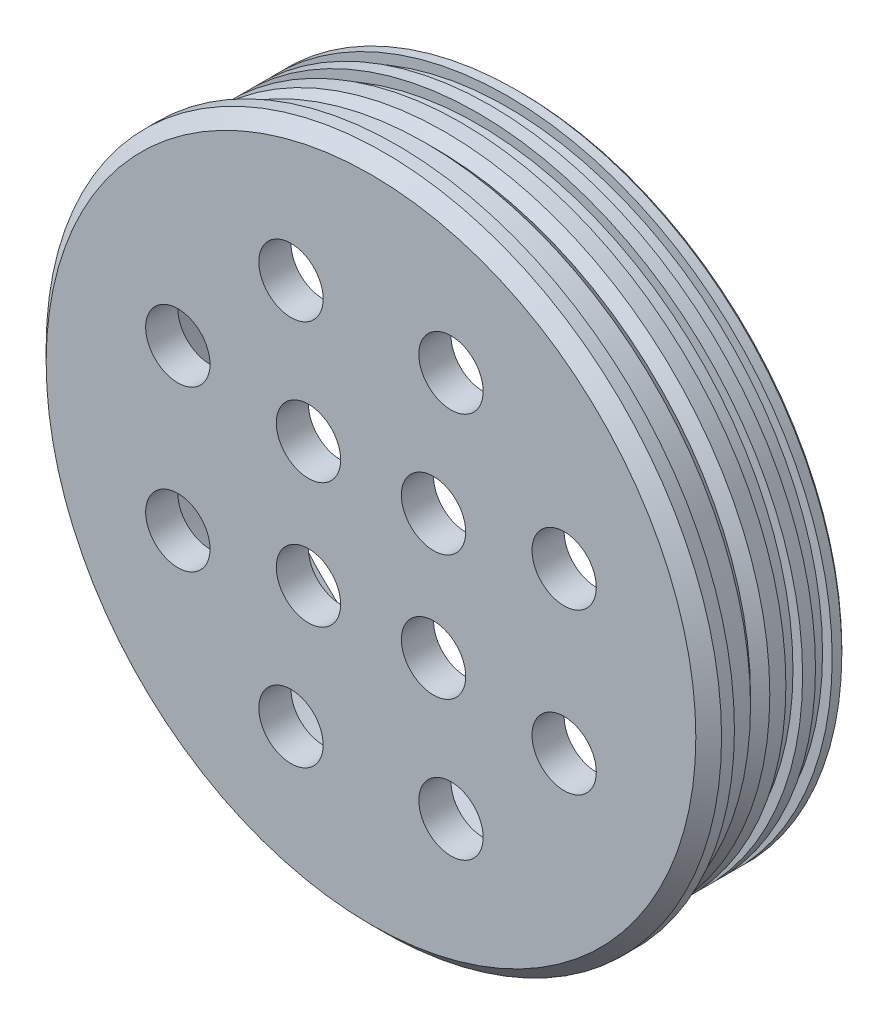
ISO-10303-21;
HEADER;
FILE_DESCRIPTION(('STEP AP214'),'2;1');
FILE_NAME('part.step','',(''),(''),'','','');
FILE_SCHEMA(('AUTOMOTIVE_DESIGN { 1 0 10303 214 1 1 1 1 }'));
ENDSEC;
DATA;
#1=APPLICATION_CONTEXT('core data for automotive mechanical design processes');
#2=APPLICATION_PROTOCOL_DEFINITION('international standard','automotive_design',2000,#1);
#3=PRODUCT_CONTEXT('',#1,'mechanical');
#4=PRODUCT('Part','Part','',(#3));
#5=PRODUCT_RELATED_PRODUCT_CATEGORY('part','',(#4));
#6=PRODUCT_DEFINITION_FORMATION('','',#4);
#7=PRODUCT_DEFINITION_CONTEXT('part definition',#1,'design');
#8=PRODUCT_DEFINITION('design','',#6,#7);
#9=PRODUCT_DEFINITION_SHAPE('','',#8);
#10=(LENGTH_UNIT() NAMED_UNIT(*) SI_UNIT(.MILLI.,.METRE.));
#11=(NAMED_UNIT(*) PLANE_ANGLE_UNIT() SI_UNIT($,.RADIAN.));
#12=(NAMED_UNIT(*) SI_UNIT($,.STERADIAN.) SOLID_ANGLE_UNIT());
#13=UNCERTAINTY_MEASURE_WITH_UNIT(LENGTH_MEASURE(1.E-05),#10,'distance_accuracy_value','');
#14=(GEOMETRIC_REPRESENTATION_CONTEXT(3) GLOBAL_UNCERTAINTY_ASSIGNED_CONTEXT((#13)) GLOBAL_UNIT_ASSIGNED_CONTEXT((#10,
#11,#12)) REPRESENTATION_CONTEXT('',''));
#15=CARTESIAN_POINT('',(0.,0.,0.));
#16=DIRECTION('',(0.,0.,1.));
#17=DIRECTION('',(1.,0.,0.));
#18=AXIS2_PLACEMENT_3D('',#15,#16,#17);
#19=CARTESIAN_POINT('',(0.,0.,-5.));
#20=DIRECTION('',(0.,0.,1.));
#21=DIRECTION('',(1.,0.,0.));
#22=AXIS2_PLACEMENT_3D('',#19,#20,#21);
#23=PLANE('',#22);
#24=CARTESIAN_POINT('',(30.0260848066168,-12.4372115518654,-5.));
#25=DIRECTION('',(0.,0.,1.));
#26=DIRECTION('',(1.,0.,0.));
#27=AXIS2_PLACEMENT_3D('',#24,#25,#26);
#28=CIRCLE('',#27,4.99999999999999);
#29=CARTESIAN_POINT('',(35.0260848066168,-12.4372115518654,-5.));
#30=VERTEX_POINT('',#29);
#31=EDGE_CURVE('E103',#30,#30,#28,.T.);
#32=ORIENTED_EDGE('',*,*,#31,.T.);
#33=EDGE_LOOP('',(#32));
#34=FACE_BOUND('',#33,.T.);
#35=CARTESIAN_POINT('',(12.4372115518654,-30.0260848066168,-5.));
#36=DIRECTION('',(0.,0.,1.));
#37=DIRECTION('',(1.,0.,0.));
#38=AXIS2_PLACEMENT_3D('',#35,#36,#37);
#39=CIRCLE('',#38,5.);
#40=CARTESIAN_POINT('',(17.4372115518654,-30.0260848066168,-5.));
#41=VERTEX_POINT('',#40);
#42=EDGE_CURVE('E106',#41,#41,#39,.T.);
#43=ORIENTED_EDGE('',*,*,#42,.T.);
#44=EDGE_LOOP('',(#43));
#45=FACE_BOUND('',#44,.T.);
#46=CARTESIAN_POINT('',(-9.72271824131503,9.72271824131503,-5.));
#47=DIRECTION('',(0.,0.,1.));
#48=DIRECTION('',(1.,0.,0.));
#49=AXIS2_PLACEMENT_3D('',#46,#47,#48);
#50=CIRCLE('',#49,5.);
#51=CARTESIAN_POINT('',(-4.72271824131503,9.72271824131503,-5.));
#52=VERTEX_POINT('',#51);
#53=EDGE_CURVE('E109',#52,#52,#50,.T.);
#54=ORIENTED_EDGE('',*,*,#53,.T.);
#55=EDGE_LOOP('',(#54));
#56=FACE_BOUND('',#55,.T.);
#57=CARTESIAN_POINT('',(9.72271824131503,9.72271824131503,-5.));
#58=DIRECTION('',(0.,0.,1.));
#59=DIRECTION('',(1.,0.,0.));
#60=AXIS2_PLACEMENT_3D('',#57,#58,#59);
#61=CIRCLE('',#60,5.);
#62=CARTESIAN_POINT('',(14.722718241315,9.72271824131503,-5.));
#63=VERTEX_POINT('',#62);
#64=EDGE_CURVE('E112',#63,#63,#61,.T.);
#65=ORIENTED_EDGE('',*,*,#64,.T.);
#66=EDGE_LOOP('',(#65));
#67=FACE_BOUND('',#66,.T.);
#68=CARTESIAN_POINT('',(9.72271824131503,-9.72271824131503,-5.));
#69=DIRECTION('',(0.,0.,1.));
#70=DIRECTION('',(1.,0.,0.));
#71=AXIS2_PLACEMENT_3D('',#68,#69,#70);
#72=CIRCLE('',#71,5.);
#73=CARTESIAN_POINT('',(14.722718241315,-9.72271824131503,-5.));
#74=VERTEX_POINT('',#73);
#75=EDGE_CURVE('E115',#74,#74,#72,.T.);
#76=ORIENTED_EDGE('',*,*,#75,.T.);
#77=EDGE_LOOP('',(#76));
#78=FACE_BOUND('',#77,.T.);
#79=CARTESIAN_POINT('',(-9.72271824131503,-9.72271824131503,-5.));
#80=DIRECTION('',(0.,0.,1.));
#81=DIRECTION('',(1.,0.,0.));
#82=AXIS2_PLACEMENT_3D('',#79,#80,#81);
#83=CIRCLE('',#82,5.);
#84=CARTESIAN_POINT('',(-4.72271824131503,-9.72271824131503,-5.));
#85=VERTEX_POINT('',#84);
#86=EDGE_CURVE('E118',#85,#85,#83,.T.);
#87=ORIENTED_EDGE('',*,*,#86,.T.);
#88=EDGE_LOOP('',(#87));
#89=FACE_BOUND('',#88,.T.);
#90=CARTESIAN_POINT('',(30.0260848066168,12.4372115518654,-5.));
#91=DIRECTION('',(0.,0.,1.));
#92=DIRECTION('',(1.,0.,0.));
#93=AXIS2_PLACEMENT_3D('',#90,#91,#92);
#94=CIRCLE('',#93,4.99999999999999);
#95=CARTESIAN_POINT('',(35.0260848066168,12.4372115518654,-5.));
#96=VERTEX_POINT('',#95);
#97=EDGE_CURVE('E121',#96,#96,#94,.T.);
#98=ORIENTED_EDGE('',*,*,#97,.T.);
#99=EDGE_LOOP('',(#98));
#100=FACE_BOUND('',#99,.T.);
#101=CARTESIAN_POINT('',(12.4372115518654,30.0260848066168,-5.));
#102=DIRECTION('',(0.,0.,1.));
#103=DIRECTION('',(1.,0.,0.));
#104=AXIS2_PLACEMENT_3D('',#101,#102,#103);
#105=CIRCLE('',#104,5.);
#106=CARTESIAN_POINT('',(17.4372115518654,30.0260848066168,-5.));
#107=VERTEX_POINT('',#106);
#108=EDGE_CURVE('E124',#107,#107,#105,.T.);
#109=ORIENTED_EDGE('',*,*,#108,.T.);
#110=EDGE_LOOP('',(#109));
#111=FACE_BOUND('',#110,.T.);
#112=CARTESIAN_POINT('',(-12.4372115518654,30.0260848066168,-5.));
#113=DIRECTION('',(0.,0.,1.));
#114=DIRECTION('',(1.,0.,0.));
#115=AXIS2_PLACEMENT_3D('',#112,#113,#114);
#116=CIRCLE('',#115,5.);
#117=CARTESIAN_POINT('',(-7.43721155186542,30.0260848066168,-5.));
#118=VERTEX_POINT('',#117);
#119=EDGE_CURVE('E127',#118,#118,#116,.T.);
#120=ORIENTED_EDGE('',*,*,#119,.T.);
#121=EDGE_LOOP('',(#120));
#122=FACE_BOUND('',#121,.T.);
#123=CARTESIAN_POINT('',(-30.0260848066168,-12.4372115518654,-5.));
#124=DIRECTION('',(0.,0.,1.));
#125=DIRECTION('',(1.,0.,0.));
#126=AXIS2_PLACEMENT_3D('',#123,#124,#125);
#127=CIRCLE('',#126,5.);
#128=CARTESIAN_POINT('',(-25.0260848066168,-12.4372115518654,-5.));
#129=VERTEX_POINT('',#128);
#130=EDGE_CURVE('E130',#129,#129,#127,.T.);
#131=ORIENTED_EDGE('',*,*,#130,.T.);
#132=EDGE_LOOP('',(#131));
#133=FACE_BOUND('',#132,.T.);
#134=CARTESIAN_POINT('',(-30.0260848066168,12.4372115518654,-5.));
#135=DIRECTION('',(0.,0.,1.));
#136=DIRECTION('',(1.,0.,0.));
#137=AXIS2_PLACEMENT_3D('',#134,#135,#136);
#138=CIRCLE('',#137,5.);
#139=CARTESIAN_POINT('',(-25.0260848066168,12.4372115518654,-5.));
#140=VERTEX_POINT('',#139);
#141=EDGE_CURVE('E133',#140,#140,#138,.T.);
#142=ORIENTED_EDGE('',*,*,#141,.T.);
#143=EDGE_LOOP('',(#142));
#144=FACE_BOUND('',#143,.T.);
#145=CARTESIAN_POINT('',(-12.4372115518654,-30.0260848066168,-5.));
#146=DIRECTION('',(0.,0.,1.));
#147=DIRECTION('',(1.,0.,0.));
#148=AXIS2_PLACEMENT_3D('',#145,#146,#147);
#149=CIRCLE('',#148,5.);
#150=CARTESIAN_POINT('',(-7.43721155186541,-30.0260848066168,-5.));
#151=VERTEX_POINT('',#150);
#152=EDGE_CURVE('E97',#151,#151,#149,.T.);
#153=ORIENTED_EDGE('',*,*,#152,.T.);
#154=EDGE_LOOP('',(#153));
#155=FACE_BOUND('',#154,.T.);
#156=CARTESIAN_POINT('',(0.,0.,-4.99999999999999));
#157=DIRECTION('',(0.,0.,1.));
#158=DIRECTION('',(1.,0.,0.));
#159=AXIS2_PLACEMENT_3D('',#156,#157,#158);
#160=CIRCLE('',#159,43.5);
#161=CARTESIAN_POINT('',(43.5,0.,-4.99999999999999));
#162=VERTEX_POINT('',#161);
#163=EDGE_CURVE('E43',#162,#162,#160,.T.);
#164=ORIENTED_EDGE('',*,*,#163,.F.);
#165=EDGE_LOOP('',(#164));
#166=FACE_BOUND('',#165,.T.);
#167=ADVANCED_FACE('F32',(#34,#45,#56,#67,#78,#89,#100,#111,#122,#133,#144,#155,#166),#23,.F.);
#168=CARTESIAN_POINT('',(0.,0.,0.));
#169=DIRECTION('',(0.,0.,1.));
#170=DIRECTION('',(1.,0.,0.));
#171=AXIS2_PLACEMENT_3D('',#168,#169,#170);
#172=CYLINDRICAL_SURFACE('',#171,43.5);
#173=CARTESIAN_POINT('',(0.,0.,-23.2));
#174=DIRECTION('',(0.,0.,1.));
#175=DIRECTION('',(1.,0.,0.));
#176=AXIS2_PLACEMENT_3D('',#173,#174,#175);
#177=CIRCLE('',#176,43.5);
#178=CARTESIAN_POINT('',(43.5,0.,-23.2));
#179=VERTEX_POINT('',#178);
#180=EDGE_CURVE('E47',#179,#179,#177,.T.);
#181=ORIENTED_EDGE('',*,*,#180,.F.);
#182=EDGE_LOOP('',(#181));
#183=FACE_BOUND('',#182,.T.);
#184=ORIENTED_EDGE('',*,*,#163,.T.);
#185=EDGE_LOOP('',(#184));
#186=FACE_BOUND('',#185,.T.);
#187=ADVANCED_FACE('F219',(#183,#186),#172,.F.);
#188=CARTESIAN_POINT('',(-43.5,0.,-23.2));
#189=DIRECTION('',(0.,0.,1.));
#190=DIRECTION('',(1.,0.,0.));
#191=AXIS2_PLACEMENT_3D('',#188,#189,#190);
#192=PLANE('',#191);
#193=CARTESIAN_POINT('',(0.,46.5,-23.2));
#194=DIRECTION('',(0.,0.,-1.));
#195=DIRECTION('',(-1.,0.,0.));
#196=AXIS2_PLACEMENT_3D('',#193,#194,#195);
#197=CIRCLE('',#196,1.5);
#198=CARTESIAN_POINT('',(-1.5,46.5,-23.2));
#199=VERTEX_POINT('',#198);
#200=EDGE_CURVE('E195',#199,#199,#197,.T.);
#201=ORIENTED_EDGE('',*,*,#200,.F.);
#202=EDGE_LOOP('',(#201));
#203=FACE_BOUND('',#202,.T.);
#204=CARTESIAN_POINT('',(40.2701812759764,23.25,-23.2));
#205=DIRECTION('',(0.,0.,-1.));
#206=DIRECTION('',(-1.,0.,0.));
#207=AXIS2_PLACEMENT_3D('',#204,#205,#206);
#208=CIRCLE('',#207,1.5);
#209=CARTESIAN_POINT('',(38.7701812759764,23.25,-23.2));
#210=VERTEX_POINT('',#209);
#211=EDGE_CURVE('E196',#210,#210,#208,.T.);
#212=ORIENTED_EDGE('',*,*,#211,.F.);
#213=EDGE_LOOP('',(#212));
#214=FACE_BOUND('',#213,.T.);
#215=CARTESIAN_POINT('',(40.2701812759764,-23.25,-23.2));
#216=DIRECTION('',(0.,0.,-1.));
#217=DIRECTION('',(-1.,0.,0.));
#218=AXIS2_PLACEMENT_3D('',#215,#216,#217);
#219=CIRCLE('',#218,1.5);
#220=CARTESIAN_POINT('',(38.7701812759764,-23.25,-23.2));
#221=VERTEX_POINT('',#220);
#222=EDGE_CURVE('E170',#221,#221,#219,.T.);
#223=ORIENTED_EDGE('',*,*,#222,.F.);
#224=EDGE_LOOP('',(#223));
#225=FACE_BOUND('',#224,.T.);
#226=CARTESIAN_POINT('',(0.,-46.5,-23.2));
#227=DIRECTION('',(0.,0.,-1.));
#228=DIRECTION('',(-1.,0.,0.));
#229=AXIS2_PLACEMENT_3D('',#226,#227,#228);
#230=CIRCLE('',#229,1.5);
#231=CARTESIAN_POINT('',(-1.50000000000001,-46.5,-23.2));
#232=VERTEX_POINT('',#231);
#233=EDGE_CURVE('E177',#232,#232,#230,.T.);
#234=ORIENTED_EDGE('',*,*,#233,.F.);
#235=EDGE_LOOP('',(#234));
#236=FACE_BOUND('',#235,.T.);
#237=CARTESIAN_POINT('',(-40.2701812759764,-23.25,-23.2));
#238=DIRECTION('',(0.,0.,-1.));
#239=DIRECTION('',(-1.,0.,0.));
#240=AXIS2_PLACEMENT_3D('',#237,#238,#239);
#241=CIRCLE('',#240,1.5);
#242=CARTESIAN_POINT('',(-41.7701812759764,-23.25,-23.2));
#243=VERTEX_POINT('',#242);
#244=EDGE_CURVE('E183',#243,#243,#241,.T.);
#245=ORIENTED_EDGE('',*,*,#244,.F.);
#246=EDGE_LOOP('',(#245));
#247=FACE_BOUND('',#246,.T.);
#248=CARTESIAN_POINT('',(-40.2701812759764,23.25,-23.2));
#249=DIRECTION('',(0.,0.,-1.));
#250=DIRECTION('',(-1.,0.,0.));
#251=AXIS2_PLACEMENT_3D('',#248,#249,#250);
#252=CIRCLE('',#251,1.5);
#253=CARTESIAN_POINT('',(-41.7701812759764,23.25,-23.2));
#254=VERTEX_POINT('',#253);
#255=EDGE_CURVE('E189',#254,#254,#252,.T.);
#256=ORIENTED_EDGE('',*,*,#255,.F.);
#257=EDGE_LOOP('',(#256));
#258=FACE_BOUND('',#257,.T.);
#259=CARTESIAN_POINT('',(0.,0.,-23.2));
#260=DIRECTION('',(0.,0.,1.));
#261=DIRECTION('',(1.,0.,0.));
#262=AXIS2_PLACEMENT_3D('',#259,#260,#261);
#263=CIRCLE('',#262,50.);
#264=CARTESIAN_POINT('',(50.,0.,-23.2));
#265=VERTEX_POINT('',#264);
#266=EDGE_CURVE('E52',#265,#265,#263,.T.);
#267=ORIENTED_EDGE('',*,*,#266,.F.);
#268=EDGE_LOOP('',(#267));
#269=FACE_BOUND('',#268,.T.);
#270=ORIENTED_EDGE('',*,*,#180,.T.);
#271=EDGE_LOOP('',(#270));
#272=FACE_BOUND('',#271,.T.);
#273=ADVANCED_FACE('F215',(#203,#214,#225,#236,#247,#258,#269,#272),#192,.F.);
#274=CARTESIAN_POINT('',(0.,0.,-23.2));
#275=DIRECTION('',(0.,0.,1.));
#276=DIRECTION('',(1.,0.,0.));
#277=AXIS2_PLACEMENT_3D('',#274,#275,#276);
#278=CONICAL_SURFACE('',#277,50.,0.785398163397455);
#279=CARTESIAN_POINT('',(0.,0.,-22.7));
#280=DIRECTION('',(0.,0.,1.));
#281=DIRECTION('',(1.,0.,0.));
#282=AXIS2_PLACEMENT_3D('',#279,#280,#281);
#283=CIRCLE('',#282,50.5);
#284=CARTESIAN_POINT('',(50.5,0.,-22.7));
#285=VERTEX_POINT('',#284);
#286=EDGE_CURVE('E55',#285,#285,#283,.T.);
#287=ORIENTED_EDGE('',*,*,#286,.F.);
#288=EDGE_LOOP('',(#287));
#289=FACE_BOUND('',#288,.T.);
#290=ORIENTED_EDGE('',*,*,#266,.T.);
#291=EDGE_LOOP('',(#290));
#292=FACE_BOUND('',#291,.T.);
#293=ADVANCED_FACE('F218',(#289,#292),#278,.T.);
#294=CARTESIAN_POINT('',(0.,0.,0.));
#295=DIRECTION('',(0.,0.,1.));
#296=DIRECTION('',(1.,0.,0.));
#297=AXIS2_PLACEMENT_3D('',#294,#295,#296);
#298=CYLINDRICAL_SURFACE('',#297,50.5);
#299=CARTESIAN_POINT('',(0.,0.,-21.2));
#300=DIRECTION('',(0.,0.,1.));
#301=DIRECTION('',(1.,0.,0.));
#302=AXIS2_PLACEMENT_3D('',#299,#300,#301);
#303=CIRCLE('',#302,50.5);
#304=CARTESIAN_POINT('',(50.5,0.,-21.2));
#305=VERTEX_POINT('',#304);
#306=EDGE_CURVE('E58',#305,#305,#303,.T.);
#307=ORIENTED_EDGE('',*,*,#306,.F.);
#308=EDGE_LOOP('',(#307));
#309=FACE_BOUND('',#308,.T.);
#310=ORIENTED_EDGE('',*,*,#286,.T.);
#311=EDGE_LOOP('',(#310));
#312=FACE_BOUND('',#311,.T.);
#313=ADVANCED_FACE('F248',(#309,#312),#298,.T.);
#314=CARTESIAN_POINT('',(-49.,0.,-21.2));
#315=DIRECTION('',(0.,0.,-1.));
#316=DIRECTION('',(-1.,0.,0.));
#317=AXIS2_PLACEMENT_3D('',#314,#315,#316);
#318=PLANE('',#317);
#319=CARTESIAN_POINT('',(0.,0.,-21.2));
#320=DIRECTION('',(0.,0.,1.));
#321=DIRECTION('',(1.,0.,0.));
#322=AXIS2_PLACEMENT_3D('',#319,#320,#321);
#323=CIRCLE('',#322,49.);
#324=CARTESIAN_POINT('',(49.,0.,-21.2));
#325=VERTEX_POINT('',#324);
#326=EDGE_CURVE('E61',#325,#325,#323,.T.);
#327=ORIENTED_EDGE('',*,*,#326,.F.);
#328=EDGE_LOOP('',(#327));
#329=FACE_BOUND('',#328,.T.);
#330=ORIENTED_EDGE('',*,*,#306,.T.);
#331=EDGE_LOOP('',(#330));
#332=FACE_BOUND('',#331,.T.);
#333=ADVANCED_FACE('F252',(#329,#332),#318,.F.);
#334=CARTESIAN_POINT('',(0.,0.,0.));
#335=DIRECTION('',(0.,0.,1.));
#336=DIRECTION('',(1.,0.,0.));
#337=AXIS2_PLACEMENT_3D('',#334,#335,#336);
#338=CYLINDRICAL_SURFACE('',#337,49.);
#339=CARTESIAN_POINT('',(0.,0.,-18.6));
#340=DIRECTION('',(0.,0.,1.));
#341=DIRECTION('',(1.,0.,0.));
#342=AXIS2_PLACEMENT_3D('',#339,#340,#341);
#343=CIRCLE('',#342,49.);
#344=CARTESIAN_POINT('',(49.,0.,-18.6));
#345=VERTEX_POINT('',#344);
#346=EDGE_CURVE('E64',#345,#345,#343,.T.);
#347=ORIENTED_EDGE('',*,*,#346,.F.);
#348=EDGE_LOOP('',(#347));
#349=FACE_BOUND('',#348,.T.);
#350=ORIENTED_EDGE('',*,*,#326,.T.);
#351=EDGE_LOOP('',(#350));
#352=FACE_BOUND('',#351,.T.);
#353=ADVANCED_FACE('F256',(#349,#352),#338,.T.);
#354=CARTESIAN_POINT('',(-50.5,0.,-18.6));
#355=DIRECTION('',(0.,0.,1.));
#356=DIRECTION('',(1.,0.,0.));
#357=AXIS2_PLACEMENT_3D('',#354,#355,#356);
#358=PLANE('',#357);
#359=CARTESIAN_POINT('',(0.,0.,-18.6));
#360=DIRECTION('',(0.,0.,1.));
#361=DIRECTION('',(1.,0.,0.));
#362=AXIS2_PLACEMENT_3D('',#359,#360,#361);
#363=CIRCLE('',#362,50.5);
#364=CARTESIAN_POINT('',(50.5,0.,-18.6));
#365=VERTEX_POINT('',#364);
#366=EDGE_CURVE('E67',#365,#365,#363,.T.);
#367=ORIENTED_EDGE('',*,*,#366,.F.);
#368=EDGE_LOOP('',(#367));
#369=FACE_BOUND('',#368,.T.);
#370=ORIENTED_EDGE('',*,*,#346,.T.);
#371=EDGE_LOOP('',(#370));
#372=FACE_BOUND('',#371,.T.);
#373=ADVANCED_FACE('F260',(#369,#372),#358,.F.);
#374=CARTESIAN_POINT('',(0.,0.,0.));
#375=DIRECTION('',(0.,0.,1.));
#376=DIRECTION('',(1.,0.,0.));
#377=AXIS2_PLACEMENT_3D('',#374,#375,#376);
#378=CYLINDRICAL_SURFACE('',#377,50.5);
#379=CARTESIAN_POINT('',(0.,0.,-16.6));
#380=DIRECTION('',(0.,0.,1.));
#381=DIRECTION('',(1.,0.,0.));
#382=AXIS2_PLACEMENT_3D('',#379,#380,#381);
#383=CIRCLE('',#382,50.5);
#384=CARTESIAN_POINT('',(50.5,0.,-16.6));
#385=VERTEX_POINT('',#384);
#386=EDGE_CURVE('E70',#385,#385,#383,.T.);
#387=ORIENTED_EDGE('',*,*,#386,.F.);
#388=EDGE_LOOP('',(#387));
#389=FACE_BOUND('',#388,.T.);
#390=ORIENTED_EDGE('',*,*,#366,.T.);
#391=EDGE_LOOP('',(#390));
#392=FACE_BOUND('',#391,.T.);
#393=ADVANCED_FACE('F264',(#389,#392),#378,.T.);
#394=CARTESIAN_POINT('',(-50.5,0.,-16.6));
#395=DIRECTION('',(0.,0.,-1.));
#396=DIRECTION('',(-1.,0.,0.));
#397=AXIS2_PLACEMENT_3D('',#394,#395,#396);
#398=PLANE('',#397);
#399=CARTESIAN_POINT('',(0.,0.,-16.6));
#400=DIRECTION('',(0.,0.,1.));
#401=DIRECTION('',(1.,0.,0.));
#402=AXIS2_PLACEMENT_3D('',#399,#400,#401);
#403=CIRCLE('',#402,49.);
#404=CARTESIAN_POINT('',(49.,0.,-16.6));
#405=VERTEX_POINT('',#404);
#406=EDGE_CURVE('E73',#405,#405,#403,.T.);
#407=ORIENTED_EDGE('',*,*,#406,.F.);
#408=EDGE_LOOP('',(#407));
#409=FACE_BOUND('',#408,.T.);
#410=ORIENTED_EDGE('',*,*,#386,.T.);
#411=EDGE_LOOP('',(#410));
#412=FACE_BOUND('',#411,.T.);
#413=ADVANCED_FACE('F268',(#409,#412),#398,.F.);
#414=CARTESIAN_POINT('',(0.,0.,0.));
#415=DIRECTION('',(0.,0.,1.));
#416=DIRECTION('',(1.,0.,0.));
#417=AXIS2_PLACEMENT_3D('',#414,#415,#416);
#418=CYLINDRICAL_SURFACE('',#417,49.);
#419=CARTESIAN_POINT('',(0.,0.,-14.));
#420=DIRECTION('',(0.,0.,1.));
#421=DIRECTION('',(1.,0.,0.));
#422=AXIS2_PLACEMENT_3D('',#419,#420,#421);
#423=CIRCLE('',#422,49.);
#424=CARTESIAN_POINT('',(49.,0.,-14.));
#425=VERTEX_POINT('',#424);
#426=EDGE_CURVE('E76',#425,#425,#423,.T.);
#427=ORIENTED_EDGE('',*,*,#426,.F.);
#428=EDGE_LOOP('',(#427));
#429=FACE_BOUND('',#428,.T.);
#430=ORIENTED_EDGE('',*,*,#406,.T.);
#431=EDGE_LOOP('',(#430));
#432=FACE_BOUND('',#431,.T.);
#433=ADVANCED_FACE('F272',(#429,#432),#418,.T.);
#434=CARTESIAN_POINT('',(-49.,0.,-14.));
#435=DIRECTION('',(0.,0.,1.));
#436=DIRECTION('',(1.,0.,0.));
#437=AXIS2_PLACEMENT_3D('',#434,#435,#436);
#438=PLANE('',#437);
#439=CARTESIAN_POINT('',(0.,0.,-14.));
#440=DIRECTION('',(0.,0.,1.));
#441=DIRECTION('',(1.,0.,0.));
#442=AXIS2_PLACEMENT_3D('',#439,#440,#441);
#443=CIRCLE('',#442,50.5);
#444=CARTESIAN_POINT('',(50.5,0.,-14.));
#445=VERTEX_POINT('',#444);
#446=EDGE_CURVE('E79',#445,#445,#443,.T.);
#447=ORIENTED_EDGE('',*,*,#446,.F.);
#448=EDGE_LOOP('',(#447));
#449=FACE_BOUND('',#448,.T.);
#450=ORIENTED_EDGE('',*,*,#426,.T.);
#451=EDGE_LOOP('',(#450));
#452=FACE_BOUND('',#451,.T.);
#453=ADVANCED_FACE('F276',(#449,#452),#438,.F.);
#454=CARTESIAN_POINT('',(0.,0.,0.));
#455=DIRECTION('',(0.,0.,1.));
#456=DIRECTION('',(1.,0.,0.));
#457=AXIS2_PLACEMENT_3D('',#454,#455,#456);
#458=CYLINDRICAL_SURFACE('',#457,50.5);
#459=CARTESIAN_POINT('',(0.,0.,-11.5));
#460=DIRECTION('',(0.,0.,1.));
#461=DIRECTION('',(1.,0.,0.));
#462=AXIS2_PLACEMENT_3D('',#459,#460,#461);
#463=CIRCLE('',#462,50.5);
#464=CARTESIAN_POINT('',(50.5,0.,-11.5));
#465=VERTEX_POINT('',#464);
#466=EDGE_CURVE('E82',#465,#465,#463,.T.);
#467=ORIENTED_EDGE('',*,*,#466,.F.);
#468=EDGE_LOOP('',(#467));
#469=FACE_BOUND('',#468,.T.);
#470=ORIENTED_EDGE('',*,*,#446,.T.);
#471=EDGE_LOOP('',(#470));
#472=FACE_BOUND('',#471,.T.);
#473=ADVANCED_FACE('F280',(#469,#472),#458,.T.);
#474=CARTESIAN_POINT('',(0.,0.,-11.5));
#475=DIRECTION('',(0.,0.,-1.));
#476=DIRECTION('',(-1.,0.,0.));
#477=AXIS2_PLACEMENT_3D('',#474,#475,#476);
#478=CONICAL_SURFACE('',#477,50.5,0.785398163397448);
#479=CARTESIAN_POINT('',(0.,0.,-9.99999999999999));
#480=DIRECTION('',(0.,0.,1.));
#481=DIRECTION('',(1.,0.,0.));
#482=AXIS2_PLACEMENT_3D('',#479,#480,#481);
#483=CIRCLE('',#482,49.);
#484=CARTESIAN_POINT('',(49.,0.,-9.99999999999999));
#485=VERTEX_POINT('',#484);
#486=EDGE_CURVE('E85',#485,#485,#483,.T.);
#487=ORIENTED_EDGE('',*,*,#486,.F.);
#488=EDGE_LOOP('',(#487));
#489=FACE_BOUND('',#488,.T.);
#490=ORIENTED_EDGE('',*,*,#466,.T.);
#491=EDGE_LOOP('',(#490));
#492=FACE_BOUND('',#491,.T.);
#493=ADVANCED_FACE('F284',(#489,#492),#478,.T.);
#494=CARTESIAN_POINT('',(0.,0.,-9.99999999999999));
#495=DIRECTION('',(0.,0.,1.));
#496=DIRECTION('',(1.,0.,0.));
#497=AXIS2_PLACEMENT_3D('',#494,#495,#496);
#498=CONICAL_SURFACE('',#497,49.,0.785398163397448);
#499=CARTESIAN_POINT('',(0.,0.,-8.49999999999999));
#500=DIRECTION('',(0.,0.,1.));
#501=DIRECTION('',(1.,0.,0.));
#502=AXIS2_PLACEMENT_3D('',#499,#500,#501);
#503=CIRCLE('',#502,50.5);
#504=CARTESIAN_POINT('',(50.5,0.,-8.49999999999999));
#505=VERTEX_POINT('',#504);
#506=EDGE_CURVE('E88',#505,#505,#503,.T.);
#507=ORIENTED_EDGE('',*,*,#506,.F.);
#508=EDGE_LOOP('',(#507));
#509=FACE_BOUND('',#508,.T.);
#510=ORIENTED_EDGE('',*,*,#486,.T.);
#511=EDGE_LOOP('',(#510));
#512=FACE_BOUND('',#511,.T.);
#513=ADVANCED_FACE('F288',(#509,#512),#498,.T.);
#514=CARTESIAN_POINT('',(0.,0.,0.));
#515=DIRECTION('',(0.,0.,1.));
#516=DIRECTION('',(1.,0.,0.));
#517=AXIS2_PLACEMENT_3D('',#514,#515,#516);
#518=CYLINDRICAL_SURFACE('',#517,50.5);
#519=CARTESIAN_POINT('',(0.,0.,-3.99999999999999));
#520=DIRECTION('',(0.,0.,1.));
#521=DIRECTION('',(1.,0.,0.));
#522=AXIS2_PLACEMENT_3D('',#519,#520,#521);
#523=CIRCLE('',#522,50.5);
#524=CARTESIAN_POINT('',(50.5,0.,-3.99999999999999));
#525=VERTEX_POINT('',#524);
#526=EDGE_CURVE('E91',#525,#525,#523,.T.);
#527=ORIENTED_EDGE('',*,*,#526,.F.);
#528=EDGE_LOOP('',(#527));
#529=FACE_BOUND('',#528,.T.);
#530=ORIENTED_EDGE('',*,*,#506,.T.);
#531=EDGE_LOOP('',(#530));
#532=FACE_BOUND('',#531,.T.);
#533=ADVANCED_FACE('F292',(#529,#532),#518,.T.);
#534=CARTESIAN_POINT('',(-50.5,0.,-4.));
#535=DIRECTION('',(0.,0.,1.));
#536=DIRECTION('',(1.,0.,0.));
#537=AXIS2_PLACEMENT_3D('',#534,#535,#536);
#538=PLANE('',#537);
#539=CARTESIAN_POINT('',(0.,0.,-4.));
#540=DIRECTION('',(0.,0.,1.));
#541=DIRECTION('',(1.,0.,0.));
#542=AXIS2_PLACEMENT_3D('',#539,#540,#541);
#543=CIRCLE('',#542,52.5);
#544=CARTESIAN_POINT('',(52.5,0.,-4.));
#545=VERTEX_POINT('',#544);
#546=EDGE_CURVE('E94',#545,#545,#543,.T.);
#547=ORIENTED_EDGE('',*,*,#546,.F.);
#548=EDGE_LOOP('',(#547));
#549=FACE_BOUND('',#548,.T.);
#550=ORIENTED_EDGE('',*,*,#526,.T.);
#551=EDGE_LOOP('',(#550));
#552=FACE_BOUND('',#551,.T.);
#553=ADVANCED_FACE('F296',(#549,#552),#538,.F.);
#554=CARTESIAN_POINT('',(0.,0.,0.));
#555=DIRECTION('',(0.,0.,1.));
#556=DIRECTION('',(1.,0.,0.));
#557=AXIS2_PLACEMENT_3D('',#554,#555,#556);
#558=CYLINDRICAL_SURFACE('',#557,52.5);
#559=CARTESIAN_POINT('',(0.,0.,-2.00000000000002));
#560=DIRECTION('',(0.,0.,-1.));
#561=DIRECTION('',(-1.,0.,0.));
#562=AXIS2_PLACEMENT_3D('',#559,#560,#561);
#563=CIRCLE('',#562,52.5);
#564=CARTESIAN_POINT('',(-52.5,0.,-2.00000000000002));
#565=VERTEX_POINT('',#564);
#566=EDGE_CURVE('E10',#565,#565,#563,.T.);
#567=ORIENTED_EDGE('',*,*,#566,.T.);
#568=EDGE_LOOP('',(#567));
#569=FACE_BOUND('',#568,.T.);
#570=ORIENTED_EDGE('',*,*,#546,.T.);
#571=EDGE_LOOP('',(#570));
#572=FACE_BOUND('',#571,.T.);
#573=ADVANCED_FACE('F300',(#569,#572),#558,.T.);
#574=CARTESIAN_POINT('',(-52.5,0.,0.));
#575=DIRECTION('',(0.,0.,-1.));
#576=DIRECTION('',(-1.,0.,0.));
#577=AXIS2_PLACEMENT_3D('',#574,#575,#576);
#578=PLANE('',#577);
#579=CARTESIAN_POINT('',(30.0260848066168,-12.4372115518654,0.));
#580=DIRECTION('',(0.,0.,1.));
#581=DIRECTION('',(1.,0.,0.));
#582=AXIS2_PLACEMENT_3D('',#579,#580,#581);
#583=CIRCLE('',#582,4.99999999999999);
#584=CARTESIAN_POINT('',(35.0260848066168,-12.4372115518654,0.));
#585=VERTEX_POINT('',#584);
#586=EDGE_CURVE('E141',#585,#585,#583,.T.);
#587=ORIENTED_EDGE('',*,*,#586,.F.);
#588=EDGE_LOOP('',(#587));
#589=FACE_BOUND('',#588,.T.);
#590=CARTESIAN_POINT('',(12.4372115518654,-30.0260848066168,0.));
#591=DIRECTION('',(0.,0.,1.));
#592=DIRECTION('',(1.,0.,0.));
#593=AXIS2_PLACEMENT_3D('',#590,#591,#592);
#594=CIRCLE('',#593,5.);
#595=CARTESIAN_POINT('',(17.4372115518654,-30.0260848066168,0.));
#596=VERTEX_POINT('',#595);
#597=EDGE_CURVE('E155',#596,#596,#594,.T.);
#598=ORIENTED_EDGE('',*,*,#597,.F.);
#599=EDGE_LOOP('',(#598));
#600=FACE_BOUND('',#599,.T.);
#601=CARTESIAN_POINT('',(-9.72271824131503,9.72271824131503,0.));
#602=DIRECTION('',(0.,0.,1.));
#603=DIRECTION('',(1.,0.,0.));
#604=AXIS2_PLACEMENT_3D('',#601,#602,#603);
#605=CIRCLE('',#604,5.);
#606=CARTESIAN_POINT('',(-4.72271824131503,9.72271824131503,0.));
#607=VERTEX_POINT('',#606);
#608=EDGE_CURVE('E152',#607,#607,#605,.T.);
#609=ORIENTED_EDGE('',*,*,#608,.F.);
#610=EDGE_LOOP('',(#609));
#611=FACE_BOUND('',#610,.T.);
#612=CARTESIAN_POINT('',(9.72271824131503,9.72271824131503,0.));
#613=DIRECTION('',(0.,0.,1.));
#614=DIRECTION('',(1.,0.,0.));
#615=AXIS2_PLACEMENT_3D('',#612,#613,#614);
#616=CIRCLE('',#615,5.);
#617=CARTESIAN_POINT('',(14.722718241315,9.72271824131503,0.));
#618=VERTEX_POINT('',#617);
#619=EDGE_CURVE('E156',#618,#618,#616,.T.);
#620=ORIENTED_EDGE('',*,*,#619,.F.);
#621=EDGE_LOOP('',(#620));
#622=FACE_BOUND('',#621,.T.);
#623=CARTESIAN_POINT('',(9.72271824131503,-9.72271824131503,0.));
#624=DIRECTION('',(0.,0.,1.));
#625=DIRECTION('',(1.,0.,0.));
#626=AXIS2_PLACEMENT_3D('',#623,#624,#625);
#627=CIRCLE('',#626,5.);
#628=CARTESIAN_POINT('',(14.722718241315,-9.72271824131503,0.));
#629=VERTEX_POINT('',#628);
#630=EDGE_CURVE('E164',#629,#629,#627,.T.);
#631=ORIENTED_EDGE('',*,*,#630,.F.);
#632=EDGE_LOOP('',(#631));
#633=FACE_BOUND('',#632,.T.);
#634=CARTESIAN_POINT('',(-9.72271824131503,-9.72271824131503,0.));
#635=DIRECTION('',(0.,0.,1.));
#636=DIRECTION('',(1.,0.,0.));
#637=AXIS2_PLACEMENT_3D('',#634,#635,#636);
#638=CIRCLE('',#637,5.);
#639=CARTESIAN_POINT('',(-4.72271824131503,-9.72271824131503,0.));
#640=VERTEX_POINT('',#639);
#641=EDGE_CURVE('E161',#640,#640,#638,.T.);
#642=ORIENTED_EDGE('',*,*,#641,.F.);
#643=EDGE_LOOP('',(#642));
#644=FACE_BOUND('',#643,.T.);
#645=CARTESIAN_POINT('',(30.0260848066168,12.4372115518654,0.));
#646=DIRECTION('',(0.,0.,1.));
#647=DIRECTION('',(1.,0.,0.));
#648=AXIS2_PLACEMENT_3D('',#645,#646,#647);
#649=CIRCLE('',#648,4.99999999999999);
#650=CARTESIAN_POINT('',(35.0260848066168,12.4372115518654,0.));
#651=VERTEX_POINT('',#650);
#652=EDGE_CURVE('E137',#651,#651,#649,.T.);
#653=ORIENTED_EDGE('',*,*,#652,.F.);
#654=EDGE_LOOP('',(#653));
#655=FACE_BOUND('',#654,.T.);
#656=CARTESIAN_POINT('',(12.4372115518654,30.0260848066168,0.));
#657=DIRECTION('',(0.,0.,1.));
#658=DIRECTION('',(1.,0.,0.));
#659=AXIS2_PLACEMENT_3D('',#656,#657,#658);
#660=CIRCLE('',#659,5.);
#661=CARTESIAN_POINT('',(17.4372115518654,30.0260848066168,0.));
#662=VERTEX_POINT('',#661);
#663=EDGE_CURVE('E140',#662,#662,#660,.T.);
#664=ORIENTED_EDGE('',*,*,#663,.F.);
#665=EDGE_LOOP('',(#664));
#666=FACE_BOUND('',#665,.T.);
#667=CARTESIAN_POINT('',(-12.4372115518654,30.0260848066168,0.));
#668=DIRECTION('',(0.,0.,1.));
#669=DIRECTION('',(1.,0.,0.));
#670=AXIS2_PLACEMENT_3D('',#667,#668,#669);
#671=CIRCLE('',#670,5.);
#672=CARTESIAN_POINT('',(-7.43721155186542,30.0260848066168,0.));
#673=VERTEX_POINT('',#672);
#674=EDGE_CURVE('E144',#673,#673,#671,.T.);
#675=ORIENTED_EDGE('',*,*,#674,.F.);
#676=EDGE_LOOP('',(#675));
#677=FACE_BOUND('',#676,.T.);
#678=CARTESIAN_POINT('',(-30.0260848066168,-12.4372115518654,0.));
#679=DIRECTION('',(0.,0.,1.));
#680=DIRECTION('',(1.,0.,0.));
#681=AXIS2_PLACEMENT_3D('',#678,#679,#680);
#682=CIRCLE('',#681,5.);
#683=CARTESIAN_POINT('',(-25.0260848066168,-12.4372115518654,0.));
#684=VERTEX_POINT('',#683);
#685=EDGE_CURVE('E147',#684,#684,#682,.T.);
#686=ORIENTED_EDGE('',*,*,#685,.F.);
#687=EDGE_LOOP('',(#686));
#688=FACE_BOUND('',#687,.T.);
#689=CARTESIAN_POINT('',(-30.0260848066168,12.4372115518654,0.));
#690=DIRECTION('',(0.,0.,1.));
#691=DIRECTION('',(1.,0.,0.));
#692=AXIS2_PLACEMENT_3D('',#689,#690,#691);
#693=CIRCLE('',#692,5.);
#694=CARTESIAN_POINT('',(-25.0260848066168,12.4372115518654,0.));
#695=VERTEX_POINT('',#694);
#696=EDGE_CURVE('E136',#695,#695,#693,.T.);
#697=ORIENTED_EDGE('',*,*,#696,.F.);
#698=EDGE_LOOP('',(#697));
#699=FACE_BOUND('',#698,.T.);
#700=CARTESIAN_POINT('',(-12.4372115518654,-30.0260848066168,0.));
#701=DIRECTION('',(0.,0.,1.));
#702=DIRECTION('',(1.,0.,0.));
#703=AXIS2_PLACEMENT_3D('',#700,#701,#702);
#704=CIRCLE('',#703,5.);
#705=CARTESIAN_POINT('',(-7.43721155186541,-30.0260848066168,0.));
#706=VERTEX_POINT('',#705);
#707=EDGE_CURVE('E100',#706,#706,#704,.T.);
#708=ORIENTED_EDGE('',*,*,#707,.F.);
#709=EDGE_LOOP('',(#708));
#710=FACE_BOUND('',#709,.T.);
#711=CARTESIAN_POINT('',(0.,0.,0.));
#712=DIRECTION('',(0.,0.,-1.));
#713=DIRECTION('',(-1.,0.,0.));
#714=AXIS2_PLACEMENT_3D('',#711,#712,#713);
#715=CIRCLE('',#714,50.5);
#716=CARTESIAN_POINT('',(-50.5,0.,0.));
#717=VERTEX_POINT('',#716);
#718=EDGE_CURVE('E39',#717,#717,#715,.F.);
#719=ORIENTED_EDGE('',*,*,#718,.T.);
#720=EDGE_LOOP('',(#719));
#721=FACE_BOUND('',#720,.T.);
#722=ADVANCED_FACE('F304',(#589,#600,#611,#622,#633,#644,#655,#666,#677,#688,#699,#710,#721),
#578,.F.);
#723=CARTESIAN_POINT('',(0.,0.,0.));
#724=DIRECTION('',(0.,0.,-1.));
#725=DIRECTION('',(-1.,0.,0.));
#726=AXIS2_PLACEMENT_3D('',#723,#724,#725);
#727=CONICAL_SURFACE('',#726,50.5,0.785398163397448);
#728=ORIENTED_EDGE('',*,*,#566,.F.);
#729=EDGE_LOOP('',(#728));
#730=FACE_BOUND('',#729,.T.);
#731=ORIENTED_EDGE('',*,*,#718,.F.);
#732=EDGE_LOOP('',(#731));
#733=FACE_BOUND('',#732,.T.);
#734=ADVANCED_FACE('F34',(#730,#733),#727,.T.);
#735=CARTESIAN_POINT('',(-12.4372115518654,-30.0260848066168,-10.));
#736=DIRECTION('',(0.,0.,1.));
#737=DIRECTION('',(1.,0.,0.));
#738=AXIS2_PLACEMENT_3D('',#735,#736,#737);
#739=CYLINDRICAL_SURFACE('',#738,5.);
#740=ORIENTED_EDGE('',*,*,#707,.T.);
#741=EDGE_LOOP('',(#740));
#742=FACE_BOUND('',#741,.T.);
#743=ORIENTED_EDGE('',*,*,#152,.F.);
#744=EDGE_LOOP('',(#743));
#745=FACE_BOUND('',#744,.T.);
#746=ADVANCED_FACE('F308',(#742,#745),#739,.F.);
#747=CARTESIAN_POINT('',(-30.0260848066168,12.4372115518654,-10.));
#748=DIRECTION('',(0.,0.,1.));
#749=DIRECTION('',(1.,0.,0.));
#750=AXIS2_PLACEMENT_3D('',#747,#748,#749);
#751=CYLINDRICAL_SURFACE('',#750,5.);
#752=ORIENTED_EDGE('',*,*,#696,.T.);
#753=EDGE_LOOP('',(#752));
#754=FACE_BOUND('',#753,.T.);
#755=ORIENTED_EDGE('',*,*,#141,.F.);
#756=EDGE_LOOP('',(#755));
#757=FACE_BOUND('',#756,.T.);
#758=ADVANCED_FACE('F311',(#754,#757),#751,.F.);
#759=CARTESIAN_POINT('',(-30.0260848066168,-12.4372115518654,-10.));
#760=DIRECTION('',(0.,0.,1.));
#761=DIRECTION('',(1.,0.,0.));
#762=AXIS2_PLACEMENT_3D('',#759,#760,#761);
#763=CYLINDRICAL_SURFACE('',#762,5.);
#764=ORIENTED_EDGE('',*,*,#685,.T.);
#765=EDGE_LOOP('',(#764));
#766=FACE_BOUND('',#765,.T.);
#767=ORIENTED_EDGE('',*,*,#130,.F.);
#768=EDGE_LOOP('',(#767));
#769=FACE_BOUND('',#768,.T.);
#770=ADVANCED_FACE('F325',(#766,#769),#763,.F.);
#771=CARTESIAN_POINT('',(-12.4372115518654,30.0260848066168,-10.));
#772=DIRECTION('',(0.,0.,1.));
#773=DIRECTION('',(1.,0.,0.));
#774=AXIS2_PLACEMENT_3D('',#771,#772,#773);
#775=CYLINDRICAL_SURFACE('',#774,5.);
#776=ORIENTED_EDGE('',*,*,#674,.T.);
#777=EDGE_LOOP('',(#776));
#778=FACE_BOUND('',#777,.T.);
#779=ORIENTED_EDGE('',*,*,#119,.F.);
#780=EDGE_LOOP('',(#779));
#781=FACE_BOUND('',#780,.T.);
#782=ADVANCED_FACE('F321',(#778,#781),#775,.F.);
#783=CARTESIAN_POINT('',(12.4372115518654,30.0260848066168,-10.));
#784=DIRECTION('',(0.,0.,1.));
#785=DIRECTION('',(1.,0.,0.));
#786=AXIS2_PLACEMENT_3D('',#783,#784,#785);
#787=CYLINDRICAL_SURFACE('',#786,5.);
#788=ORIENTED_EDGE('',*,*,#663,.T.);
#789=EDGE_LOOP('',(#788));
#790=FACE_BOUND('',#789,.T.);
#791=ORIENTED_EDGE('',*,*,#108,.F.);
#792=EDGE_LOOP('',(#791));
#793=FACE_BOUND('',#792,.T.);
#794=ADVANCED_FACE('F317',(#790,#793),#787,.F.);
#795=CARTESIAN_POINT('',(30.0260848066168,12.4372115518654,-10.));
#796=DIRECTION('',(0.,0.,1.));
#797=DIRECTION('',(1.,0.,0.));
#798=AXIS2_PLACEMENT_3D('',#795,#796,#797);
#799=CYLINDRICAL_SURFACE('',#798,4.99999999999999);
#800=ORIENTED_EDGE('',*,*,#652,.T.);
#801=EDGE_LOOP('',(#800));
#802=FACE_BOUND('',#801,.T.);
#803=ORIENTED_EDGE('',*,*,#97,.F.);
#804=EDGE_LOOP('',(#803));
#805=FACE_BOUND('',#804,.T.);
#806=ADVANCED_FACE('F313',(#802,#805),#799,.F.);
#807=CARTESIAN_POINT('',(-9.72271824131503,-9.72271824131503,-10.));
#808=DIRECTION('',(0.,0.,1.));
#809=DIRECTION('',(1.,0.,0.));
#810=AXIS2_PLACEMENT_3D('',#807,#808,#809);
#811=CYLINDRICAL_SURFACE('',#810,5.);
#812=ORIENTED_EDGE('',*,*,#641,.T.);
#813=EDGE_LOOP('',(#812));
#814=FACE_BOUND('',#813,.T.);
#815=ORIENTED_EDGE('',*,*,#86,.F.);
#816=EDGE_LOOP('',(#815));
#817=FACE_BOUND('',#816,.T.);
#818=ADVANCED_FACE('F316',(#814,#817),#811,.F.);
#819=CARTESIAN_POINT('',(9.72271824131503,-9.72271824131503,-10.));
#820=DIRECTION('',(0.,0.,1.));
#821=DIRECTION('',(1.,0.,0.));
#822=AXIS2_PLACEMENT_3D('',#819,#820,#821);
#823=CYLINDRICAL_SURFACE('',#822,5.);
#824=ORIENTED_EDGE('',*,*,#630,.T.);
#825=EDGE_LOOP('',(#824));
#826=FACE_BOUND('',#825,.T.);
#827=ORIENTED_EDGE('',*,*,#75,.F.);
#828=EDGE_LOOP('',(#827));
#829=FACE_BOUND('',#828,.T.);
#830=ADVANCED_FACE('F349',(#826,#829),#823,.F.);
#831=CARTESIAN_POINT('',(9.72271824131503,9.72271824131503,-10.));
#832=DIRECTION('',(0.,0.,1.));
#833=DIRECTION('',(1.,0.,0.));
#834=AXIS2_PLACEMENT_3D('',#831,#832,#833);
#835=CYLINDRICAL_SURFACE('',#834,5.);
#836=ORIENTED_EDGE('',*,*,#619,.T.);
#837=EDGE_LOOP('',(#836));
#838=FACE_BOUND('',#837,.T.);
#839=ORIENTED_EDGE('',*,*,#64,.F.);
#840=EDGE_LOOP('',(#839));
#841=FACE_BOUND('',#840,.T.);
#842=ADVANCED_FACE('F337',(#838,#841),#835,.F.);
#843=CARTESIAN_POINT('',(-9.72271824131503,9.72271824131503,-10.));
#844=DIRECTION('',(0.,0.,1.));
#845=DIRECTION('',(1.,0.,0.));
#846=AXIS2_PLACEMENT_3D('',#843,#844,#845);
#847=CYLINDRICAL_SURFACE('',#846,5.);
#848=ORIENTED_EDGE('',*,*,#608,.T.);
#849=EDGE_LOOP('',(#848));
#850=FACE_BOUND('',#849,.T.);
#851=ORIENTED_EDGE('',*,*,#53,.F.);
#852=EDGE_LOOP('',(#851));
#853=FACE_BOUND('',#852,.T.);
#854=ADVANCED_FACE('F333',(#850,#853),#847,.F.);
#855=CARTESIAN_POINT('',(12.4372115518654,-30.0260848066168,-10.));
#856=DIRECTION('',(0.,0.,1.));
#857=DIRECTION('',(1.,0.,0.));
#858=AXIS2_PLACEMENT_3D('',#855,#856,#857);
#859=CYLINDRICAL_SURFACE('',#858,5.);
#860=ORIENTED_EDGE('',*,*,#597,.T.);
#861=EDGE_LOOP('',(#860));
#862=FACE_BOUND('',#861,.T.);
#863=ORIENTED_EDGE('',*,*,#42,.F.);
#864=EDGE_LOOP('',(#863));
#865=FACE_BOUND('',#864,.T.);
#866=ADVANCED_FACE('F336',(#862,#865),#859,.F.);
#867=CARTESIAN_POINT('',(30.0260848066168,-12.4372115518654,-10.));
#868=DIRECTION('',(0.,0.,1.));
#869=DIRECTION('',(1.,0.,0.));
#870=AXIS2_PLACEMENT_3D('',#867,#868,#869);
#871=CYLINDRICAL_SURFACE('',#870,4.99999999999999);
#872=ORIENTED_EDGE('',*,*,#586,.T.);
#873=EDGE_LOOP('',(#872));
#874=FACE_BOUND('',#873,.T.);
#875=ORIENTED_EDGE('',*,*,#31,.F.);
#876=EDGE_LOOP('',(#875));
#877=FACE_BOUND('',#876,.T.);
#878=ADVANCED_FACE('F341',(#874,#877),#871,.F.);
#879=CARTESIAN_POINT('',(-40.2701812759764,23.25,-13.2));
#880=DIRECTION('',(0.,0.,-1.));
#881=DIRECTION('',(-1.,0.,0.));
#882=AXIS2_PLACEMENT_3D('',#879,#880,#881);
#883=CYLINDRICAL_SURFACE('',#882,1.5);
#884=CARTESIAN_POINT('',(-40.2701812759764,23.25,-13.2));
#885=DIRECTION('',(0.,0.,-1.));
#886=DIRECTION('',(-1.,0.,0.));
#887=AXIS2_PLACEMENT_3D('',#884,#885,#886);
#888=CIRCLE('',#887,1.5);
#889=CARTESIAN_POINT('',(-41.7701812759764,23.25,-13.2));
#890=VERTEX_POINT('',#889);
#891=EDGE_CURVE('E192',#890,#890,#888,.T.);
#892=ORIENTED_EDGE('',*,*,#891,.F.);
#893=EDGE_LOOP('',(#892));
#894=FACE_BOUND('',#893,.T.);
#895=ORIENTED_EDGE('',*,*,#255,.T.);
#896=EDGE_LOOP('',(#895));
#897=FACE_BOUND('',#896,.T.);
#898=ADVANCED_FACE('F345',(#894,#897),#883,.F.);
#899=CARTESIAN_POINT('',(-40.2701812759764,23.25,-13.2));
#900=DIRECTION('',(0.,0.,-1.));
#901=DIRECTION('',(-1.,0.,0.));
#902=AXIS2_PLACEMENT_3D('',#899,#900,#901);
#903=PLANE('',#902);
#904=ORIENTED_EDGE('',*,*,#891,.T.);
#905=EDGE_LOOP('',(#904));
#906=FACE_BOUND('',#905,.T.);
#907=ADVANCED_FACE('F378',(#906),#903,.T.);
#908=CARTESIAN_POINT('',(-40.2701812759764,-23.25,-13.2));
#909=DIRECTION('',(0.,0.,-1.));
#910=DIRECTION('',(-1.,0.,0.));
#911=AXIS2_PLACEMENT_3D('',#908,#909,#910);
#912=CYLINDRICAL_SURFACE('',#911,1.5);
#913=CARTESIAN_POINT('',(-40.2701812759764,-23.25,-13.2));
#914=DIRECTION('',(0.,0.,-1.));
#915=DIRECTION('',(-1.,0.,0.));
#916=AXIS2_PLACEMENT_3D('',#913,#914,#915);
#917=CIRCLE('',#916,1.5);
#918=CARTESIAN_POINT('',(-41.7701812759764,-23.25,-13.2));
#919=VERTEX_POINT('',#918);
#920=EDGE_CURVE('E186',#919,#919,#917,.T.);
#921=ORIENTED_EDGE('',*,*,#920,.F.);
#922=EDGE_LOOP('',(#921));
#923=FACE_BOUND('',#922,.T.);
#924=ORIENTED_EDGE('',*,*,#244,.T.);
#925=EDGE_LOOP('',(#924));
#926=FACE_BOUND('',#925,.T.);
#927=ADVANCED_FACE('F375',(#923,#926),#912,.F.);
#928=CARTESIAN_POINT('',(-40.2701812759764,-23.25,-13.2));
#929=DIRECTION('',(0.,0.,-1.));
#930=DIRECTION('',(-1.,0.,0.));
#931=AXIS2_PLACEMENT_3D('',#928,#929,#930);
#932=PLANE('',#931);
#933=ORIENTED_EDGE('',*,*,#920,.T.);
#934=EDGE_LOOP('',(#933));
#935=FACE_BOUND('',#934,.T.);
#936=ADVANCED_FACE('F370',(#935),#932,.T.);
#937=CARTESIAN_POINT('',(0.,-46.5,-13.2));
#938=DIRECTION('',(0.,0.,-1.));
#939=DIRECTION('',(-1.,0.,0.));
#940=AXIS2_PLACEMENT_3D('',#937,#938,#939);
#941=CYLINDRICAL_SURFACE('',#940,1.5);
#942=CARTESIAN_POINT('',(0.,-46.5,-13.2));
#943=DIRECTION('',(0.,0.,-1.));
#944=DIRECTION('',(-1.,0.,0.));
#945=AXIS2_PLACEMENT_3D('',#942,#943,#944);
#946=CIRCLE('',#945,1.5);
#947=CARTESIAN_POINT('',(-1.50000000000001,-46.5,-13.2));
#948=VERTEX_POINT('',#947);
#949=EDGE_CURVE('E180',#948,#948,#946,.T.);
#950=ORIENTED_EDGE('',*,*,#949,.F.);
#951=EDGE_LOOP('',(#950));
#952=FACE_BOUND('',#951,.T.);
#953=ORIENTED_EDGE('',*,*,#233,.T.);
#954=EDGE_LOOP('',(#953));
#955=FACE_BOUND('',#954,.T.);
#956=ADVANCED_FACE('F367',(#952,#955),#941,.F.);
#957=CARTESIAN_POINT('',(0.,-46.5,-13.2));
#958=DIRECTION('',(0.,0.,-1.));
#959=DIRECTION('',(-1.,0.,0.));
#960=AXIS2_PLACEMENT_3D('',#957,#958,#959);
#961=PLANE('',#960);
#962=ORIENTED_EDGE('',*,*,#949,.T.);
#963=EDGE_LOOP('',(#962));
#964=FACE_BOUND('',#963,.T.);
#965=ADVANCED_FACE('F361',(#964),#961,.T.);
#966=CARTESIAN_POINT('',(40.2701812759764,-23.25,-13.2));
#967=DIRECTION('',(0.,0.,-1.));
#968=DIRECTION('',(-1.,0.,0.));
#969=AXIS2_PLACEMENT_3D('',#966,#967,#968);
#970=CYLINDRICAL_SURFACE('',#969,1.5);
#971=CARTESIAN_POINT('',(40.2701812759764,-23.25,-13.2));
#972=DIRECTION('',(0.,0.,-1.));
#973=DIRECTION('',(-1.,0.,0.));
#974=AXIS2_PLACEMENT_3D('',#971,#972,#973);
#975=CIRCLE('',#974,1.5);
#976=CARTESIAN_POINT('',(38.7701812759764,-23.25,-13.2));
#977=VERTEX_POINT('',#976);
#978=EDGE_CURVE('E173',#977,#977,#975,.T.);
#979=ORIENTED_EDGE('',*,*,#978,.F.);
#980=EDGE_LOOP('',(#979));
#981=FACE_BOUND('',#980,.T.);
#982=ORIENTED_EDGE('',*,*,#222,.T.);
#983=EDGE_LOOP('',(#982));
#984=FACE_BOUND('',#983,.T.);
#985=ADVANCED_FACE('F357',(#981,#984),#970,.F.);
#986=CARTESIAN_POINT('',(40.2701812759764,-23.25,-13.2));
#987=DIRECTION('',(0.,0.,-1.));
#988=DIRECTION('',(-1.,0.,0.));
#989=AXIS2_PLACEMENT_3D('',#986,#987,#988);
#990=PLANE('',#989);
#991=ORIENTED_EDGE('',*,*,#978,.T.);
#992=EDGE_LOOP('',(#991));
#993=FACE_BOUND('',#992,.T.);
#994=ADVANCED_FACE('F360',(#993),#990,.T.);
#995=CARTESIAN_POINT('',(40.2701812759764,23.25,-13.2));
#996=DIRECTION('',(0.,0.,-1.));
#997=DIRECTION('',(-1.,0.,0.));
#998=AXIS2_PLACEMENT_3D('',#995,#996,#997);
#999=CYLINDRICAL_SURFACE('',#998,1.5);
#1000=CARTESIAN_POINT('',(40.2701812759764,23.25,-13.2));
#1001=DIRECTION('',(0.,0.,-1.));
#1002=DIRECTION('',(-1.,0.,0.));
#1003=AXIS2_PLACEMENT_3D('',#1000,#1001,#1002);
#1004=CIRCLE('',#1003,1.5);
#1005=CARTESIAN_POINT('',(38.7701812759764,23.25,-13.2));
#1006=VERTEX_POINT('',#1005);
#1007=EDGE_CURVE('E174',#1006,#1006,#1004,.T.);
#1008=ORIENTED_EDGE('',*,*,#1007,.F.);
#1009=EDGE_LOOP('',(#1008));
#1010=FACE_BOUND('',#1009,.T.);
#1011=ORIENTED_EDGE('',*,*,#211,.T.);
#1012=EDGE_LOOP('',(#1011));
#1013=FACE_BOUND('',#1012,.T.);
#1014=ADVANCED_FACE('F365',(#1010,#1013),#999,.F.);
#1015=CARTESIAN_POINT('',(40.2701812759764,23.25,-13.2));
#1016=DIRECTION('',(0.,0.,-1.));
#1017=DIRECTION('',(-1.,0.,0.));
#1018=AXIS2_PLACEMENT_3D('',#1015,#1016,#1017);
#1019=PLANE('',#1018);
#1020=ORIENTED_EDGE('',*,*,#1007,.T.);
#1021=EDGE_LOOP('',(#1020));
#1022=FACE_BOUND('',#1021,.T.);
#1023=ADVANCED_FACE('F211',(#1022),#1019,.T.);
#1024=CARTESIAN_POINT('',(0.,46.5,-13.2));
#1025=DIRECTION('',(0.,0.,-1.));
#1026=DIRECTION('',(-1.,0.,0.));
#1027=AXIS2_PLACEMENT_3D('',#1024,#1025,#1026);
#1028=CYLINDRICAL_SURFACE('',#1027,1.5);
#1029=CARTESIAN_POINT('',(0.,46.5,-13.2));
#1030=DIRECTION('',(0.,0.,-1.));
#1031=DIRECTION('',(-1.,0.,0.));
#1032=AXIS2_PLACEMENT_3D('',#1029,#1030,#1031);
#1033=CIRCLE('',#1032,1.5);
#1034=CARTESIAN_POINT('',(-1.5,46.5,-13.2));
#1035=VERTEX_POINT('',#1034);
#1036=EDGE_CURVE('E165',#1035,#1035,#1033,.T.);
#1037=ORIENTED_EDGE('',*,*,#1036,.F.);
#1038=EDGE_LOOP('',(#1037));
#1039=FACE_BOUND('',#1038,.T.);
#1040=ORIENTED_EDGE('',*,*,#200,.T.);
#1041=EDGE_LOOP('',(#1040));
#1042=FACE_BOUND('',#1041,.T.);
#1043=ADVANCED_FACE('F208',(#1039,#1042),#1028,.F.);
#1044=CARTESIAN_POINT('',(0.,46.5,-13.2));
#1045=DIRECTION('',(0.,0.,-1.));
#1046=DIRECTION('',(-1.,0.,0.));
#1047=AXIS2_PLACEMENT_3D('',#1044,#1045,#1046);
#1048=PLANE('',#1047);
#1049=ORIENTED_EDGE('',*,*,#1036,.T.);
#1050=EDGE_LOOP('',(#1049));
#1051=FACE_BOUND('',#1050,.T.);
#1052=ADVANCED_FACE('F206',(#1051),#1048,.T.);
#1053=CLOSED_SHELL('',(#167,#187,#273,#293,#313,#333,#353,#373,#393,#413,#433,#453,#473,#493,
#513,#533,#553,#573,#722,#734,#746,#758,#770,#782,#794,#806,#818,#830,#842,#854,#866,#878,#898,
#907,#927,#936,#956,#965,#985,#994,#1014,#1023,#1043,#1052));
#1054=MANIFOLD_SOLID_BREP('B2',#1053);
#1055=ADVANCED_BREP_SHAPE_REPRESENTATION('',(#18,#1054),#14);
#1056=SHAPE_DEFINITION_REPRESENTATION(#9,#1055);
ENDSEC;
END-ISO-10303-21;
